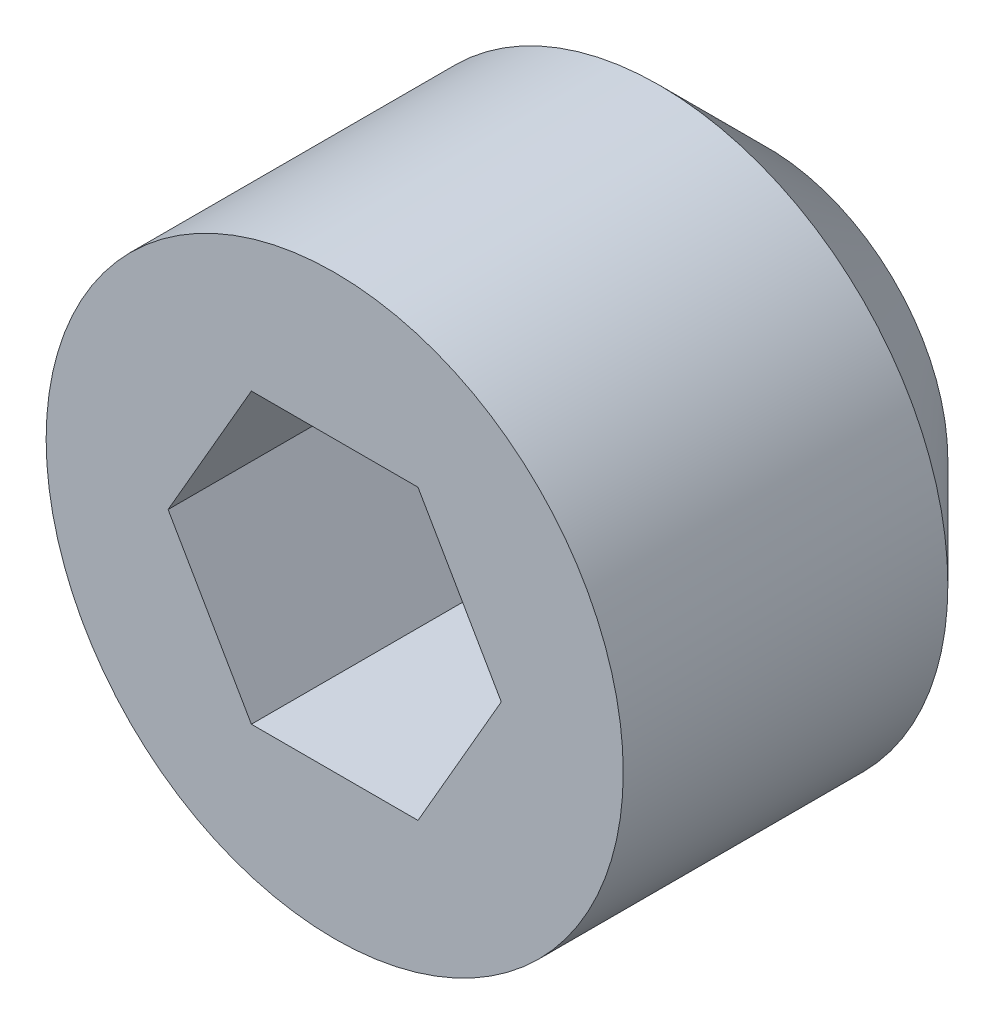
ISO-10303-21;
HEADER;
FILE_DESCRIPTION(('STEP AP214'),'2;1');
FILE_NAME('part.step','',(''),(''),'','','');
FILE_SCHEMA(('AUTOMOTIVE_DESIGN { 1 0 10303 214 1 1 1 1 }'));
ENDSEC;
DATA;
#1=APPLICATION_CONTEXT('core data for automotive mechanical design processes');
#2=APPLICATION_PROTOCOL_DEFINITION('international standard','automotive_design',2000,#1);
#3=PRODUCT_CONTEXT('',#1,'mechanical');
#4=PRODUCT('Part','Part','',(#3));
#5=PRODUCT_RELATED_PRODUCT_CATEGORY('part','',(#4));
#6=PRODUCT_DEFINITION_FORMATION('','',#4);
#7=PRODUCT_DEFINITION_CONTEXT('part definition',#1,'design');
#8=PRODUCT_DEFINITION('design','',#6,#7);
#9=PRODUCT_DEFINITION_SHAPE('','',#8);
#10=(LENGTH_UNIT() NAMED_UNIT(*) SI_UNIT(.MILLI.,.METRE.));
#11=(NAMED_UNIT(*) PLANE_ANGLE_UNIT() SI_UNIT($,.RADIAN.));
#12=(NAMED_UNIT(*) SI_UNIT($,.STERADIAN.) SOLID_ANGLE_UNIT());
#13=UNCERTAINTY_MEASURE_WITH_UNIT(LENGTH_MEASURE(1.E-05),#10,'distance_accuracy_value','');
#14=(GEOMETRIC_REPRESENTATION_CONTEXT(3) GLOBAL_UNCERTAINTY_ASSIGNED_CONTEXT((#13)) GLOBAL_UNIT_ASSIGNED_CONTEXT((#10,
#11,#12)) REPRESENTATION_CONTEXT('',''));
#15=CARTESIAN_POINT('',(0.,0.,0.));
#16=DIRECTION('',(0.,0.,1.));
#17=DIRECTION('',(1.,0.,0.));
#18=AXIS2_PLACEMENT_3D('',#15,#16,#17);
#19=CARTESIAN_POINT('',(0.,0.,-3.));
#20=DIRECTION('',(0.,0.,1.));
#21=DIRECTION('',(1.,0.,0.));
#22=AXIS2_PLACEMENT_3D('',#19,#20,#21);
#23=CYLINDRICAL_SURFACE('',#22,2.);
#24=CARTESIAN_POINT('',(0.,0.,0.));
#25=DIRECTION('',(0.,0.,1.));
#26=DIRECTION('',(1.,0.,0.));
#27=AXIS2_PLACEMENT_3D('',#24,#25,#26);
#28=CIRCLE('',#27,2.);
#29=CARTESIAN_POINT('',(2.,0.,0.));
#30=VERTEX_POINT('',#29);
#31=EDGE_CURVE('E11',#30,#30,#28,.T.);
#32=ORIENTED_EDGE('',*,*,#31,.F.);
#33=EDGE_LOOP('',(#32));
#34=FACE_BOUND('',#33,.T.);
#35=CARTESIAN_POINT('',(0.,0.,-2.25000000000001));
#36=DIRECTION('',(0.,0.,1.));
#37=DIRECTION('',(1.,0.,0.));
#38=AXIS2_PLACEMENT_3D('',#35,#36,#37);
#39=CIRCLE('',#38,2.);
#40=CARTESIAN_POINT('',(2.,0.,-2.25000000000001));
#41=VERTEX_POINT('',#40);
#42=EDGE_CURVE('E126',#41,#41,#39,.T.);
#43=ORIENTED_EDGE('',*,*,#42,.T.);
#44=EDGE_LOOP('',(#43));
#45=FACE_BOUND('',#44,.T.);
#46=ADVANCED_FACE('F38',(#34,#45),#23,.T.);
#47=CARTESIAN_POINT('',(0.,0.,0.));
#48=DIRECTION('',(0.,0.,1.));
#49=DIRECTION('',(1.,0.,0.));
#50=AXIS2_PLACEMENT_3D('',#47,#48,#49);
#51=PLANE('',#50);
#52=DIRECTION('',(0.499999999999999,0.866025403784439,0.));
#53=VECTOR('',#52,1.);
#54=CARTESIAN_POINT('',(0.577350269189626,-1.,0.));
#55=LINE('',#54,#53);
#56=CARTESIAN_POINT('',(0.577350269189626,-1.,0.));
#57=VERTEX_POINT('',#56);
#58=CARTESIAN_POINT('',(1.15470053837925,0.,0.));
#59=VERTEX_POINT('',#58);
#60=EDGE_CURVE('E52',#57,#59,#55,.T.);
#61=ORIENTED_EDGE('',*,*,#60,.F.);
#62=DIRECTION('',(1.,0.,0.));
#63=VECTOR('',#62,1.);
#64=CARTESIAN_POINT('',(-0.577350269189625,-1.,0.));
#65=LINE('',#64,#63);
#66=CARTESIAN_POINT('',(-0.577350269189625,-1.,0.));
#67=VERTEX_POINT('',#66);
#68=EDGE_CURVE('E135',#67,#57,#65,.T.);
#69=ORIENTED_EDGE('',*,*,#68,.F.);
#70=DIRECTION('',(0.5,-0.866025403784438,0.));
#71=VECTOR('',#70,1.);
#72=CARTESIAN_POINT('',(-1.15470053837925,0.,0.));
#73=LINE('',#72,#71);
#74=CARTESIAN_POINT('',(-1.15470053837925,0.,0.));
#75=VERTEX_POINT('',#74);
#76=EDGE_CURVE('E133',#75,#67,#73,.T.);
#77=ORIENTED_EDGE('',*,*,#76,.F.);
#78=DIRECTION('',(-0.499999999999999,-0.866025403784439,0.));
#79=VECTOR('',#78,1.);
#80=CARTESIAN_POINT('',(-0.577350269189626,1.,0.));
#81=LINE('',#80,#79);
#82=CARTESIAN_POINT('',(-0.577350269189626,1.,0.));
#83=VERTEX_POINT('',#82);
#84=EDGE_CURVE('E99',#83,#75,#81,.T.);
#85=ORIENTED_EDGE('',*,*,#84,.F.);
#86=DIRECTION('',(-1.,0.,0.));
#87=VECTOR('',#86,1.);
#88=CARTESIAN_POINT('',(0.577350269189625,1.,0.));
#89=LINE('',#88,#87);
#90=CARTESIAN_POINT('',(0.577350269189625,1.,0.));
#91=VERTEX_POINT('',#90);
#92=EDGE_CURVE('E129',#91,#83,#89,.T.);
#93=ORIENTED_EDGE('',*,*,#92,.F.);
#94=DIRECTION('',(-0.5,0.866025403784438,0.));
#95=VECTOR('',#94,1.);
#96=CARTESIAN_POINT('',(1.15470053837925,0.,0.));
#97=LINE('',#96,#95);
#98=EDGE_CURVE('E125',#59,#91,#97,.T.);
#99=ORIENTED_EDGE('',*,*,#98,.F.);
#100=EDGE_LOOP('',(#61,#69,#77,#85,#93,#99));
#101=FACE_BOUND('',#100,.T.);
#102=ORIENTED_EDGE('',*,*,#31,.T.);
#103=EDGE_LOOP('',(#102));
#104=FACE_BOUND('',#103,.T.);
#105=ADVANCED_FACE('F147',(#101,#104),#51,.T.);
#106=CARTESIAN_POINT('',(0.577350269189626,-1.,-1.5));
#107=DIRECTION('',(0.866025403784439,-0.5,0.));
#108=DIRECTION('',(0.5,0.866025403784439,0.));
#109=AXIS2_PLACEMENT_3D('',#106,#107,#108);
#110=PLANE('',#109);
#111=ORIENTED_EDGE('',*,*,#60,.T.);
#112=DIRECTION('',(0.,0.,1.));
#113=VECTOR('',#112,1.);
#114=CARTESIAN_POINT('',(1.15470053837925,0.,-1.5));
#115=LINE('',#114,#113);
#116=CARTESIAN_POINT('',(1.15470053837925,0.,-1.5));
#117=VERTEX_POINT('',#116);
#118=EDGE_CURVE('E81',#117,#59,#115,.T.);
#119=ORIENTED_EDGE('',*,*,#118,.F.);
#120=DIRECTION('',(0.499999999999999,0.866025403784439,0.));
#121=VECTOR('',#120,1.);
#122=CARTESIAN_POINT('',(0.577350269189626,-1.,-1.5));
#123=LINE('',#122,#121);
#124=CARTESIAN_POINT('',(0.577350269189626,-1.,-1.5));
#125=VERTEX_POINT('',#124);
#126=EDGE_CURVE('E137',#125,#117,#123,.T.);
#127=ORIENTED_EDGE('',*,*,#126,.F.);
#128=DIRECTION('',(0.,0.,1.));
#129=VECTOR('',#128,1.);
#130=CARTESIAN_POINT('',(0.577350269189626,-1.,-1.5));
#131=LINE('',#130,#129);
#132=EDGE_CURVE('E45',#125,#57,#131,.T.);
#133=ORIENTED_EDGE('',*,*,#132,.T.);
#134=EDGE_LOOP('',(#111,#119,#127,#133));
#135=FACE_BOUND('',#134,.T.);
#136=ADVANCED_FACE('F176',(#135),#110,.F.);
#137=CARTESIAN_POINT('',(-0.577350269189625,-1.,-1.5));
#138=DIRECTION('',(0.,-1.,0.));
#139=DIRECTION('',(1.,0.,0.));
#140=AXIS2_PLACEMENT_3D('',#137,#138,#139);
#141=PLANE('',#140);
#142=ORIENTED_EDGE('',*,*,#68,.T.);
#143=ORIENTED_EDGE('',*,*,#132,.F.);
#144=DIRECTION('',(1.,0.,0.));
#145=VECTOR('',#144,1.);
#146=CARTESIAN_POINT('',(-0.577350269189625,-1.,-1.5));
#147=LINE('',#146,#145);
#148=CARTESIAN_POINT('',(-0.577350269189625,-1.,-1.5));
#149=VERTEX_POINT('',#148);
#150=EDGE_CURVE('E111',#149,#125,#147,.T.);
#151=ORIENTED_EDGE('',*,*,#150,.F.);
#152=DIRECTION('',(0.,0.,1.));
#153=VECTOR('',#152,1.);
#154=CARTESIAN_POINT('',(-0.577350269189625,-1.,-1.5));
#155=LINE('',#154,#153);
#156=EDGE_CURVE('E103',#149,#67,#155,.T.);
#157=ORIENTED_EDGE('',*,*,#156,.T.);
#158=EDGE_LOOP('',(#142,#143,#151,#157));
#159=FACE_BOUND('',#158,.T.);
#160=ADVANCED_FACE('F183',(#159),#141,.F.);
#161=CARTESIAN_POINT('',(-1.15470053837925,0.,-1.5));
#162=DIRECTION('',(-0.866025403784438,-0.5,0.));
#163=DIRECTION('',(0.5,-0.866025403784438,0.));
#164=AXIS2_PLACEMENT_3D('',#161,#162,#163);
#165=PLANE('',#164);
#166=ORIENTED_EDGE('',*,*,#76,.T.);
#167=ORIENTED_EDGE('',*,*,#156,.F.);
#168=DIRECTION('',(0.5,-0.866025403784438,0.));
#169=VECTOR('',#168,1.);
#170=CARTESIAN_POINT('',(-1.15470053837925,0.,-1.5));
#171=LINE('',#170,#169);
#172=CARTESIAN_POINT('',(-1.15470053837925,0.,-1.5));
#173=VERTEX_POINT('',#172);
#174=EDGE_CURVE('E107',#173,#149,#171,.T.);
#175=ORIENTED_EDGE('',*,*,#174,.F.);
#176=DIRECTION('',(0.,0.,1.));
#177=VECTOR('',#176,1.);
#178=CARTESIAN_POINT('',(-1.15470053837925,0.,-1.5));
#179=LINE('',#178,#177);
#180=EDGE_CURVE('E92',#173,#75,#179,.T.);
#181=ORIENTED_EDGE('',*,*,#180,.T.);
#182=EDGE_LOOP('',(#166,#167,#175,#181));
#183=FACE_BOUND('',#182,.T.);
#184=ADVANCED_FACE('F108',(#183),#165,.F.);
#185=CARTESIAN_POINT('',(-0.577350269189626,1.,-1.5));
#186=DIRECTION('',(-0.866025403784439,0.5,0.));
#187=DIRECTION('',(-0.5,-0.866025403784439,0.));
#188=AXIS2_PLACEMENT_3D('',#185,#186,#187);
#189=PLANE('',#188);
#190=ORIENTED_EDGE('',*,*,#84,.T.);
#191=ORIENTED_EDGE('',*,*,#180,.F.);
#192=DIRECTION('',(-0.499999999999999,-0.866025403784439,0.));
#193=VECTOR('',#192,1.);
#194=CARTESIAN_POINT('',(-0.577350269189626,1.,-1.5));
#195=LINE('',#194,#193);
#196=CARTESIAN_POINT('',(-0.577350269189626,1.,-1.5));
#197=VERTEX_POINT('',#196);
#198=EDGE_CURVE('E96',#197,#173,#195,.T.);
#199=ORIENTED_EDGE('',*,*,#198,.F.);
#200=DIRECTION('',(0.,0.,1.));
#201=VECTOR('',#200,1.);
#202=CARTESIAN_POINT('',(-0.577350269189626,1.,-1.5));
#203=LINE('',#202,#201);
#204=EDGE_CURVE('E104',#197,#83,#203,.T.);
#205=ORIENTED_EDGE('',*,*,#204,.T.);
#206=EDGE_LOOP('',(#190,#191,#199,#205));
#207=FACE_BOUND('',#206,.T.);
#208=ADVANCED_FACE('F94',(#207),#189,.F.);
#209=CARTESIAN_POINT('',(0.577350269189625,1.,-1.5));
#210=DIRECTION('',(0.,1.,0.));
#211=DIRECTION('',(-1.,0.,0.));
#212=AXIS2_PLACEMENT_3D('',#209,#210,#211);
#213=PLANE('',#212);
#214=ORIENTED_EDGE('',*,*,#92,.T.);
#215=ORIENTED_EDGE('',*,*,#204,.F.);
#216=DIRECTION('',(-1.,0.,0.));
#217=VECTOR('',#216,1.);
#218=CARTESIAN_POINT('',(0.577350269189625,1.,-1.5));
#219=LINE('',#218,#217);
#220=CARTESIAN_POINT('',(0.577350269189625,1.,-1.5));
#221=VERTEX_POINT('',#220);
#222=EDGE_CURVE('E117',#221,#197,#219,.T.);
#223=ORIENTED_EDGE('',*,*,#222,.F.);
#224=DIRECTION('',(0.,0.,1.));
#225=VECTOR('',#224,1.);
#226=CARTESIAN_POINT('',(0.577350269189625,1.,-1.5));
#227=LINE('',#226,#225);
#228=EDGE_CURVE('E141',#221,#91,#227,.T.);
#229=ORIENTED_EDGE('',*,*,#228,.T.);
#230=EDGE_LOOP('',(#214,#215,#223,#229));
#231=FACE_BOUND('',#230,.T.);
#232=ADVANCED_FACE('F151',(#231),#213,.F.);
#233=CARTESIAN_POINT('',(1.15470053837925,0.,-1.5));
#234=DIRECTION('',(0.866025403784439,0.5,0.));
#235=DIRECTION('',(-0.5,0.866025403784439,0.));
#236=AXIS2_PLACEMENT_3D('',#233,#234,#235);
#237=PLANE('',#236);
#238=ORIENTED_EDGE('',*,*,#98,.T.);
#239=ORIENTED_EDGE('',*,*,#228,.F.);
#240=DIRECTION('',(-0.5,0.866025403784438,0.));
#241=VECTOR('',#240,1.);
#242=CARTESIAN_POINT('',(1.15470053837925,0.,-1.5));
#243=LINE('',#242,#241);
#244=EDGE_CURVE('E119',#117,#221,#243,.T.);
#245=ORIENTED_EDGE('',*,*,#244,.F.);
#246=ORIENTED_EDGE('',*,*,#118,.T.);
#247=EDGE_LOOP('',(#238,#239,#245,#246));
#248=FACE_BOUND('',#247,.T.);
#249=ADVANCED_FACE('F144',(#248),#237,.F.);
#250=CARTESIAN_POINT('',(0.,0.,-1.5));
#251=DIRECTION('',(0.,0.,1.));
#252=DIRECTION('',(1.,0.,0.));
#253=AXIS2_PLACEMENT_3D('',#250,#251,#252);
#254=PLANE('',#253);
#255=ORIENTED_EDGE('',*,*,#126,.T.);
#256=ORIENTED_EDGE('',*,*,#244,.T.);
#257=ORIENTED_EDGE('',*,*,#222,.T.);
#258=ORIENTED_EDGE('',*,*,#198,.T.);
#259=ORIENTED_EDGE('',*,*,#174,.T.);
#260=ORIENTED_EDGE('',*,*,#150,.T.);
#261=EDGE_LOOP('',(#255,#256,#257,#258,#259,#260));
#262=FACE_BOUND('',#261,.T.);
#263=ADVANCED_FACE('F114',(#262),#254,.T.);
#264=CARTESIAN_POINT('',(0.,0.,-2.25000000000001));
#265=DIRECTION('',(0.,0.,1.));
#266=DIRECTION('',(1.,0.,0.));
#267=AXIS2_PLACEMENT_3D('',#264,#265,#266);
#268=CONICAL_SURFACE('',#267,2.,0.785398163397453);
#269=CARTESIAN_POINT('',(0.,0.,-3.));
#270=DIRECTION('',(0.,0.,1.));
#271=DIRECTION('',(1.,0.,0.));
#272=AXIS2_PLACEMENT_3D('',#269,#270,#271);
#273=CIRCLE('',#272,1.25);
#274=CARTESIAN_POINT('',(1.25,0.,-3.));
#275=VERTEX_POINT('',#274);
#276=EDGE_CURVE('E156',#275,#275,#273,.T.);
#277=ORIENTED_EDGE('',*,*,#276,.T.);
#278=EDGE_LOOP('',(#277));
#279=FACE_BOUND('',#278,.T.);
#280=ORIENTED_EDGE('',*,*,#42,.F.);
#281=EDGE_LOOP('',(#280));
#282=FACE_BOUND('',#281,.T.);
#283=ADVANCED_FACE('F160',(#279,#282),#268,.T.);
#284=CARTESIAN_POINT('',(0.,0.,-3.));
#285=DIRECTION('',(0.,0.,1.));
#286=DIRECTION('',(1.,0.,0.));
#287=AXIS2_PLACEMENT_3D('',#284,#285,#286);
#288=PLANE('',#287);
#289=ORIENTED_EDGE('',*,*,#276,.F.);
#290=EDGE_LOOP('',(#289));
#291=FACE_BOUND('',#290,.T.);
#292=ADVANCED_FACE('F163',(#291),#288,.F.);
#293=CLOSED_SHELL('',(#46,#105,#136,#160,#184,#208,#232,#249,#263,#283,#292));
#294=MANIFOLD_SOLID_BREP('B2',#293);
#295=ADVANCED_BREP_SHAPE_REPRESENTATION('',(#18,#294),#14);
#296=SHAPE_DEFINITION_REPRESENTATION(#9,#295);
ENDSEC;
END-ISO-10303-21;
